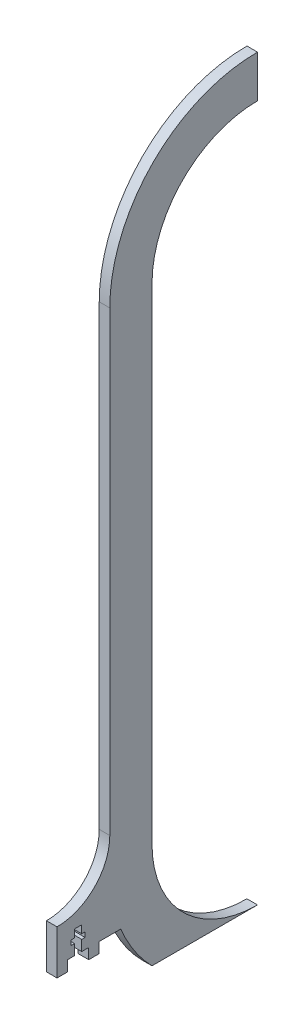
ISO-10303-21;
HEADER;
FILE_DESCRIPTION(('STEP AP214'),'2;1');
FILE_NAME('part.step','',(''),(''),'','','');
FILE_SCHEMA(('AUTOMOTIVE_DESIGN { 1 0 10303 214 1 1 1 1 }'));
ENDSEC;
DATA;
#1=APPLICATION_CONTEXT('core data for automotive mechanical design processes');
#2=APPLICATION_PROTOCOL_DEFINITION('international standard','automotive_design',2000,#1);
#3=PRODUCT_CONTEXT('',#1,'mechanical');
#4=PRODUCT('Part','Part','',(#3));
#5=PRODUCT_RELATED_PRODUCT_CATEGORY('part','',(#4));
#6=PRODUCT_DEFINITION_FORMATION('','',#4);
#7=PRODUCT_DEFINITION_CONTEXT('part definition',#1,'design');
#8=PRODUCT_DEFINITION('design','',#6,#7);
#9=PRODUCT_DEFINITION_SHAPE('','',#8);
#10=(LENGTH_UNIT() NAMED_UNIT(*) SI_UNIT(.MILLI.,.METRE.));
#11=(NAMED_UNIT(*) PLANE_ANGLE_UNIT() SI_UNIT($,.RADIAN.));
#12=(NAMED_UNIT(*) SI_UNIT($,.STERADIAN.) SOLID_ANGLE_UNIT());
#13=UNCERTAINTY_MEASURE_WITH_UNIT(LENGTH_MEASURE(1.E-05),#10,'distance_accuracy_value','');
#14=(GEOMETRIC_REPRESENTATION_CONTEXT(3) GLOBAL_UNCERTAINTY_ASSIGNED_CONTEXT((#13)) GLOBAL_UNIT_ASSIGNED_CONTEXT((#10,
#11,#12)) REPRESENTATION_CONTEXT('',''));
#15=CARTESIAN_POINT('',(0.,0.,0.));
#16=DIRECTION('',(0.,0.,1.));
#17=DIRECTION('',(1.,0.,0.));
#18=AXIS2_PLACEMENT_3D('',#15,#16,#17);
#19=CARTESIAN_POINT('',(6.35,-180.975,42.291));
#20=DIRECTION('',(0.,1.,0.));
#21=DIRECTION('',(0.,0.,1.));
#22=AXIS2_PLACEMENT_3D('',#19,#20,#21);
#23=PLANE('',#22);
#24=DIRECTION('',(0.,0.,-1.));
#25=VECTOR('',#24,1.);
#26=CARTESIAN_POINT('',(0.,-180.975,42.291));
#27=LINE('',#26,#25);
#28=CARTESIAN_POINT('',(0.,-180.975,42.291));
#29=VERTEX_POINT('',#28);
#30=CARTESIAN_POINT('',(0.,-180.975,38.1));
#31=VERTEX_POINT('',#30);
#32=EDGE_CURVE('E254',#29,#31,#27,.T.);
#33=ORIENTED_EDGE('',*,*,#32,.T.);
#34=DIRECTION('',(-1.,0.,0.));
#35=VECTOR('',#34,1.);
#36=CARTESIAN_POINT('',(6.35,-180.975,38.1));
#37=LINE('',#36,#35);
#38=CARTESIAN_POINT('',(6.35,-180.975,38.1));
#39=VERTEX_POINT('',#38);
#40=EDGE_CURVE('E11',#39,#31,#37,.T.);
#41=ORIENTED_EDGE('',*,*,#40,.F.);
#42=DIRECTION('',(0.,0.,-1.));
#43=VECTOR('',#42,1.);
#44=CARTESIAN_POINT('',(6.35,-180.975,42.291));
#45=LINE('',#44,#43);
#46=CARTESIAN_POINT('',(6.35,-180.975,42.291));
#47=VERTEX_POINT('',#46);
#48=EDGE_CURVE('E328',#47,#39,#45,.T.);
#49=ORIENTED_EDGE('',*,*,#48,.F.);
#50=DIRECTION('',(-1.,0.,0.));
#51=VECTOR('',#50,1.);
#52=CARTESIAN_POINT('',(6.35,-180.975,42.291));
#53=LINE('',#52,#51);
#54=EDGE_CURVE('E250',#47,#29,#53,.T.);
#55=ORIENTED_EDGE('',*,*,#54,.T.);
#56=EDGE_LOOP('',(#33,#41,#49,#55));
#57=FACE_BOUND('',#56,.T.);
#58=ADVANCED_FACE('F33',(#57),#23,.F.);
#59=CARTESIAN_POINT('',(6.35,-180.975,38.1));
#60=DIRECTION('',(0.,0.,-1.));
#61=DIRECTION('',(0.,1.,0.));
#62=AXIS2_PLACEMENT_3D('',#59,#60,#61);
#63=PLANE('',#62);
#64=DIRECTION('',(0.,-1.,0.));
#65=VECTOR('',#64,1.);
#66=CARTESIAN_POINT('',(0.,-180.975,38.1));
#67=LINE('',#66,#65);
#68=CARTESIAN_POINT('',(0.,-187.325,38.1));
#69=VERTEX_POINT('',#68);
#70=EDGE_CURVE('E257',#31,#69,#67,.T.);
#71=ORIENTED_EDGE('',*,*,#70,.T.);
#72=DIRECTION('',(-1.,0.,0.));
#73=VECTOR('',#72,1.);
#74=CARTESIAN_POINT('',(6.35,-187.325,38.1));
#75=LINE('',#74,#73);
#76=CARTESIAN_POINT('',(6.35,-187.325,38.1));
#77=VERTEX_POINT('',#76);
#78=EDGE_CURVE('E41',#77,#69,#75,.T.);
#79=ORIENTED_EDGE('',*,*,#78,.F.);
#80=DIRECTION('',(0.,-1.,0.));
#81=VECTOR('',#80,1.);
#82=CARTESIAN_POINT('',(6.35,-180.975,38.1));
#83=LINE('',#82,#81);
#84=EDGE_CURVE('E151',#39,#77,#83,.T.);
#85=ORIENTED_EDGE('',*,*,#84,.F.);
#86=ORIENTED_EDGE('',*,*,#40,.T.);
#87=EDGE_LOOP('',(#71,#79,#85,#86));
#88=FACE_BOUND('',#87,.T.);
#89=ADVANCED_FACE('F477',(#88),#63,.F.);
#90=CARTESIAN_POINT('',(6.35,-187.325,38.1));
#91=DIRECTION('',(0.,1.,0.));
#92=DIRECTION('',(0.,0.,1.));
#93=AXIS2_PLACEMENT_3D('',#90,#91,#92);
#94=PLANE('',#93);
#95=DIRECTION('',(0.,0.,-1.));
#96=VECTOR('',#95,1.);
#97=CARTESIAN_POINT('',(0.,-187.325,38.1));
#98=LINE('',#97,#96);
#99=CARTESIAN_POINT('',(0.,-187.325,31.75));
#100=VERTEX_POINT('',#99);
#101=EDGE_CURVE('E259',#69,#100,#98,.T.);
#102=ORIENTED_EDGE('',*,*,#101,.T.);
#103=DIRECTION('',(-1.,0.,0.));
#104=VECTOR('',#103,1.);
#105=CARTESIAN_POINT('',(6.35,-187.325,31.75));
#106=LINE('',#105,#104);
#107=CARTESIAN_POINT('',(6.35,-187.325,31.75));
#108=VERTEX_POINT('',#107);
#109=EDGE_CURVE('E383',#108,#100,#106,.T.);
#110=ORIENTED_EDGE('',*,*,#109,.F.);
#111=DIRECTION('',(0.,0.,-1.));
#112=VECTOR('',#111,1.);
#113=CARTESIAN_POINT('',(6.35,-187.325,38.1));
#114=LINE('',#113,#112);
#115=EDGE_CURVE('E390',#77,#108,#114,.T.);
#116=ORIENTED_EDGE('',*,*,#115,.F.);
#117=ORIENTED_EDGE('',*,*,#78,.T.);
#118=EDGE_LOOP('',(#102,#110,#116,#117));
#119=FACE_BOUND('',#118,.T.);
#120=ADVANCED_FACE('F388',(#119),#94,.F.);
#121=CARTESIAN_POINT('',(6.35,-180.975,31.75));
#122=DIRECTION('',(0.,0.,-1.));
#123=DIRECTION('',(0.,1.,0.));
#124=AXIS2_PLACEMENT_3D('',#121,#122,#123);
#125=PLANE('',#124);
#126=DIRECTION('',(0.,-1.,0.));
#127=VECTOR('',#126,1.);
#128=CARTESIAN_POINT('',(0.,-180.975,31.75));
#129=LINE('',#128,#127);
#130=CARTESIAN_POINT('',(0.,-180.975,31.75));
#131=VERTEX_POINT('',#130);
#132=EDGE_CURVE('E262',#131,#100,#129,.T.);
#133=ORIENTED_EDGE('',*,*,#132,.F.);
#134=DIRECTION('',(-1.,0.,0.));
#135=VECTOR('',#134,1.);
#136=CARTESIAN_POINT('',(6.35,-180.975,31.75));
#137=LINE('',#136,#135);
#138=CARTESIAN_POINT('',(6.35,-180.975,31.75));
#139=VERTEX_POINT('',#138);
#140=EDGE_CURVE('E381',#139,#131,#137,.T.);
#141=ORIENTED_EDGE('',*,*,#140,.F.);
#142=DIRECTION('',(0.,-1.,0.));
#143=VECTOR('',#142,1.);
#144=CARTESIAN_POINT('',(6.35,-180.975,31.75));
#145=LINE('',#144,#143);
#146=EDGE_CURVE('E402',#139,#108,#145,.T.);
#147=ORIENTED_EDGE('',*,*,#146,.T.);
#148=ORIENTED_EDGE('',*,*,#109,.T.);
#149=EDGE_LOOP('',(#133,#141,#147,#148));
#150=FACE_BOUND('',#149,.T.);
#151=ADVANCED_FACE('F398',(#150),#125,.T.);
#152=CARTESIAN_POINT('',(6.35,-180.975,31.75));
#153=DIRECTION('',(0.,1.,0.));
#154=DIRECTION('',(0.,0.,1.));
#155=AXIS2_PLACEMENT_3D('',#152,#153,#154);
#156=PLANE('',#155);
#157=DIRECTION('',(0.,0.,-1.));
#158=VECTOR('',#157,1.);
#159=CARTESIAN_POINT('',(0.,-180.975,31.75));
#160=LINE('',#159,#158);
#161=CARTESIAN_POINT('',(0.,-180.975,18.7886576662999));
#162=VERTEX_POINT('',#161);
#163=EDGE_CURVE('E265',#131,#162,#160,.T.);
#164=ORIENTED_EDGE('',*,*,#163,.T.);
#165=DIRECTION('',(-1.,0.,0.));
#166=VECTOR('',#165,1.);
#167=CARTESIAN_POINT('',(6.35,-180.975,18.7886576662999));
#168=LINE('',#167,#166);
#169=CARTESIAN_POINT('',(6.35,-180.975,18.7886576662999));
#170=VERTEX_POINT('',#169);
#171=EDGE_CURVE('E378',#170,#162,#168,.T.);
#172=ORIENTED_EDGE('',*,*,#171,.F.);
#173=DIRECTION('',(0.,0.,-1.));
#174=VECTOR('',#173,1.);
#175=CARTESIAN_POINT('',(6.35,-180.975,31.75));
#176=LINE('',#175,#174);
#177=EDGE_CURVE('E403',#139,#170,#176,.T.);
#178=ORIENTED_EDGE('',*,*,#177,.F.);
#179=ORIENTED_EDGE('',*,*,#140,.T.);
#180=EDGE_LOOP('',(#164,#172,#178,#179));
#181=FACE_BOUND('',#180,.T.);
#182=ADVANCED_FACE('F488',(#181),#156,.F.);
#183=CARTESIAN_POINT('',(6.35,-147.332960533307,-63.5));
#184=DIRECTION('',(-1.,0.,0.));
#185=DIRECTION('',(0.,0.,1.));
#186=AXIS2_PLACEMENT_3D('',#183,#184,#185);
#187=CYLINDRICAL_SURFACE('',#186,88.8999999999999);
#188=CARTESIAN_POINT('',(0.,-147.332960533307,-63.5));
#189=DIRECTION('',(1.,0.,0.));
#190=DIRECTION('',(0.,0.,-1.));
#191=AXIS2_PLACEMENT_3D('',#188,#189,#190);
#192=CIRCLE('',#191,88.8999999999999);
#193=CARTESIAN_POINT('',(0.,-209.55,0.));
#194=VERTEX_POINT('',#193);
#195=EDGE_CURVE('E267',#162,#194,#192,.T.);
#196=ORIENTED_EDGE('',*,*,#195,.T.);
#197=DIRECTION('',(-1.,0.,0.));
#198=VECTOR('',#197,1.);
#199=CARTESIAN_POINT('',(6.35,-209.55,0.));
#200=LINE('',#199,#198);
#201=CARTESIAN_POINT('',(6.35,-209.55,0.));
#202=VERTEX_POINT('',#201);
#203=EDGE_CURVE('E376',#202,#194,#200,.T.);
#204=ORIENTED_EDGE('',*,*,#203,.F.);
#205=CARTESIAN_POINT('',(6.35,-147.332960533307,-63.5));
#206=DIRECTION('',(1.,0.,0.));
#207=DIRECTION('',(0.,0.,-1.));
#208=AXIS2_PLACEMENT_3D('',#205,#206,#207);
#209=CIRCLE('',#208,88.8999999999999);
#210=EDGE_CURVE('E405',#170,#202,#209,.T.);
#211=ORIENTED_EDGE('',*,*,#210,.F.);
#212=ORIENTED_EDGE('',*,*,#171,.T.);
#213=EDGE_LOOP('',(#196,#204,#211,#212));
#214=FACE_BOUND('',#213,.T.);
#215=ADVANCED_FACE('F491',(#214),#187,.T.);
#216=CARTESIAN_POINT('',(6.35,-209.55,-63.5));
#217=DIRECTION('',(0.,-1.,0.));
#218=DIRECTION('',(0.,0.,-1.));
#219=AXIS2_PLACEMENT_3D('',#216,#217,#218);
#220=PLANE('',#219);
#221=DIRECTION('',(0.,0.,1.));
#222=VECTOR('',#221,1.);
#223=CARTESIAN_POINT('',(0.,-209.55,-63.5));
#224=LINE('',#223,#222);
#225=CARTESIAN_POINT('',(0.,-209.55,-63.5));
#226=VERTEX_POINT('',#225);
#227=EDGE_CURVE('E270',#226,#194,#224,.T.);
#228=ORIENTED_EDGE('',*,*,#227,.F.);
#229=DIRECTION('',(-1.,0.,0.));
#230=VECTOR('',#229,1.);
#231=CARTESIAN_POINT('',(6.35,-209.55,-63.5));
#232=LINE('',#231,#230);
#233=CARTESIAN_POINT('',(6.35,-209.55,-63.5));
#234=VERTEX_POINT('',#233);
#235=EDGE_CURVE('E374',#234,#226,#232,.T.);
#236=ORIENTED_EDGE('',*,*,#235,.F.);
#237=DIRECTION('',(0.,0.,1.));
#238=VECTOR('',#237,1.);
#239=CARTESIAN_POINT('',(6.35,-209.55,-63.5));
#240=LINE('',#239,#238);
#241=EDGE_CURVE('E411',#234,#202,#240,.T.);
#242=ORIENTED_EDGE('',*,*,#241,.T.);
#243=ORIENTED_EDGE('',*,*,#203,.T.);
#244=EDGE_LOOP('',(#228,#236,#242,#243));
#245=FACE_BOUND('',#244,.T.);
#246=ADVANCED_FACE('F495',(#245),#220,.T.);
#247=CARTESIAN_POINT('',(6.35,-146.05,-63.5));
#248=DIRECTION('',(-1.,0.,0.));
#249=DIRECTION('',(0.,0.,1.));
#250=AXIS2_PLACEMENT_3D('',#247,#248,#249);
#251=CYLINDRICAL_SURFACE('',#250,63.5);
#252=CARTESIAN_POINT('',(0.,-146.05,-63.5));
#253=DIRECTION('',(1.,0.,0.));
#254=DIRECTION('',(0.,0.,-1.));
#255=AXIS2_PLACEMENT_3D('',#252,#253,#254);
#256=CIRCLE('',#255,63.5);
#257=CARTESIAN_POINT('',(0.,-146.05,0.));
#258=VERTEX_POINT('',#257);
#259=EDGE_CURVE('E273',#258,#226,#256,.T.);
#260=ORIENTED_EDGE('',*,*,#259,.F.);
#261=DIRECTION('',(-1.,0.,0.));
#262=VECTOR('',#261,1.);
#263=CARTESIAN_POINT('',(6.35,-146.05,0.));
#264=LINE('',#263,#262);
#265=CARTESIAN_POINT('',(6.35,-146.05,0.));
#266=VERTEX_POINT('',#265);
#267=EDGE_CURVE('E372',#266,#258,#264,.T.);
#268=ORIENTED_EDGE('',*,*,#267,.F.);
#269=CARTESIAN_POINT('',(6.35,-146.05,-63.5));
#270=DIRECTION('',(1.,0.,0.));
#271=DIRECTION('',(0.,0.,-1.));
#272=AXIS2_PLACEMENT_3D('',#269,#270,#271);
#273=CIRCLE('',#272,63.5);
#274=EDGE_CURVE('E414',#266,#234,#273,.T.);
#275=ORIENTED_EDGE('',*,*,#274,.T.);
#276=ORIENTED_EDGE('',*,*,#235,.T.);
#277=EDGE_LOOP('',(#260,#268,#275,#276));
#278=FACE_BOUND('',#277,.T.);
#279=ADVANCED_FACE('F499',(#278),#251,.F.);
#280=CARTESIAN_POINT('',(6.35,146.05,0.));
#281=DIRECTION('',(0.,0.,-1.));
#282=DIRECTION('',(-1.,0.,0.));
#283=AXIS2_PLACEMENT_3D('',#280,#281,#282);
#284=PLANE('',#283);
#285=DIRECTION('',(0.,-1.,0.));
#286=VECTOR('',#285,1.);
#287=CARTESIAN_POINT('',(0.,146.05,0.));
#288=LINE('',#287,#286);
#289=CARTESIAN_POINT('',(0.,146.05,0.));
#290=VERTEX_POINT('',#289);
#291=EDGE_CURVE('E276',#290,#258,#288,.T.);
#292=ORIENTED_EDGE('',*,*,#291,.F.);
#293=DIRECTION('',(-1.,0.,0.));
#294=VECTOR('',#293,1.);
#295=CARTESIAN_POINT('',(6.35,146.05,0.));
#296=LINE('',#295,#294);
#297=CARTESIAN_POINT('',(6.35,146.05,0.));
#298=VERTEX_POINT('',#297);
#299=EDGE_CURVE('E370',#298,#290,#296,.T.);
#300=ORIENTED_EDGE('',*,*,#299,.F.);
#301=DIRECTION('',(0.,-1.,0.));
#302=VECTOR('',#301,1.);
#303=CARTESIAN_POINT('',(6.35,146.05,0.));
#304=LINE('',#303,#302);
#305=EDGE_CURVE('E417',#298,#266,#304,.T.);
#306=ORIENTED_EDGE('',*,*,#305,.T.);
#307=ORIENTED_EDGE('',*,*,#267,.T.);
#308=EDGE_LOOP('',(#292,#300,#306,#307));
#309=FACE_BOUND('',#308,.T.);
#310=ADVANCED_FACE('F503',(#309),#284,.T.);
#311=CARTESIAN_POINT('',(6.35,146.05,-63.5));
#312=DIRECTION('',(-1.,0.,0.));
#313=DIRECTION('',(0.,0.,1.));
#314=AXIS2_PLACEMENT_3D('',#311,#312,#313);
#315=CYLINDRICAL_SURFACE('',#314,63.5);
#316=CARTESIAN_POINT('',(0.,146.05,-63.5));
#317=DIRECTION('',(-1.,0.,0.));
#318=DIRECTION('',(0.,0.,1.));
#319=AXIS2_PLACEMENT_3D('',#316,#317,#318);
#320=CIRCLE('',#319,63.5);
#321=CARTESIAN_POINT('',(0.,209.55,-63.5));
#322=VERTEX_POINT('',#321);
#323=EDGE_CURVE('E279',#290,#322,#320,.T.);
#324=ORIENTED_EDGE('',*,*,#323,.T.);
#325=DIRECTION('',(-1.,0.,0.));
#326=VECTOR('',#325,1.);
#327=CARTESIAN_POINT('',(6.35,209.55,-63.5));
#328=LINE('',#327,#326);
#329=CARTESIAN_POINT('',(6.35,209.55,-63.5));
#330=VERTEX_POINT('',#329);
#331=EDGE_CURVE('E367',#330,#322,#328,.T.);
#332=ORIENTED_EDGE('',*,*,#331,.F.);
#333=CARTESIAN_POINT('',(6.35,146.05,-63.5));
#334=DIRECTION('',(-1.,0.,0.));
#335=DIRECTION('',(0.,0.,1.));
#336=AXIS2_PLACEMENT_3D('',#333,#334,#335);
#337=CIRCLE('',#336,63.5);
#338=EDGE_CURVE('E420',#298,#330,#337,.T.);
#339=ORIENTED_EDGE('',*,*,#338,.F.);
#340=ORIENTED_EDGE('',*,*,#299,.T.);
#341=EDGE_LOOP('',(#324,#332,#339,#340));
#342=FACE_BOUND('',#341,.T.);
#343=ADVANCED_FACE('F507',(#342),#315,.F.);
#344=CARTESIAN_POINT('',(6.35,209.55,-63.5));
#345=DIRECTION('',(0.,0.,1.));
#346=DIRECTION('',(1.,0.,0.));
#347=AXIS2_PLACEMENT_3D('',#344,#345,#346);
#348=PLANE('',#347);
#349=DIRECTION('',(0.,1.,0.));
#350=VECTOR('',#349,1.);
#351=CARTESIAN_POINT('',(0.,209.55,-63.5));
#352=LINE('',#351,#350);
#353=CARTESIAN_POINT('',(0.,234.95,-63.5));
#354=VERTEX_POINT('',#353);
#355=EDGE_CURVE('E281',#322,#354,#352,.T.);
#356=ORIENTED_EDGE('',*,*,#355,.T.);
#357=DIRECTION('',(-1.,0.,0.));
#358=VECTOR('',#357,1.);
#359=CARTESIAN_POINT('',(6.35,234.95,-63.5));
#360=LINE('',#359,#358);
#361=CARTESIAN_POINT('',(6.35,234.95,-63.5));
#362=VERTEX_POINT('',#361);
#363=EDGE_CURVE('E364',#362,#354,#360,.T.);
#364=ORIENTED_EDGE('',*,*,#363,.F.);
#365=DIRECTION('',(0.,1.,0.));
#366=VECTOR('',#365,1.);
#367=CARTESIAN_POINT('',(6.35,209.55,-63.5));
#368=LINE('',#367,#366);
#369=EDGE_CURVE('E422',#330,#362,#368,.T.);
#370=ORIENTED_EDGE('',*,*,#369,.F.);
#371=ORIENTED_EDGE('',*,*,#331,.T.);
#372=EDGE_LOOP('',(#356,#364,#370,#371));
#373=FACE_BOUND('',#372,.T.);
#374=ADVANCED_FACE('F511',(#373),#348,.F.);
#375=CARTESIAN_POINT('',(6.35,146.05,-63.5));
#376=DIRECTION('',(-1.,0.,0.));
#377=DIRECTION('',(0.,0.,1.));
#378=AXIS2_PLACEMENT_3D('',#375,#376,#377);
#379=CYLINDRICAL_SURFACE('',#378,88.9);
#380=CARTESIAN_POINT('',(0.,146.05,-63.5));
#381=DIRECTION('',(1.,0.,0.));
#382=DIRECTION('',(0.,0.,-1.));
#383=AXIS2_PLACEMENT_3D('',#380,#381,#382);
#384=CIRCLE('',#383,88.9);
#385=CARTESIAN_POINT('',(0.,146.05,25.4));
#386=VERTEX_POINT('',#385);
#387=EDGE_CURVE('E283',#354,#386,#384,.T.);
#388=ORIENTED_EDGE('',*,*,#387,.T.);
#389=DIRECTION('',(-1.,0.,0.));
#390=VECTOR('',#389,1.);
#391=CARTESIAN_POINT('',(6.35,146.05,25.4));
#392=LINE('',#391,#390);
#393=CARTESIAN_POINT('',(6.35,146.05,25.4));
#394=VERTEX_POINT('',#393);
#395=EDGE_CURVE('E361',#394,#386,#392,.T.);
#396=ORIENTED_EDGE('',*,*,#395,.F.);
#397=CARTESIAN_POINT('',(6.35,146.05,-63.5));
#398=DIRECTION('',(1.,0.,0.));
#399=DIRECTION('',(0.,0.,-1.));
#400=AXIS2_PLACEMENT_3D('',#397,#398,#399);
#401=CIRCLE('',#400,88.9);
#402=EDGE_CURVE('E424',#362,#394,#401,.T.);
#403=ORIENTED_EDGE('',*,*,#402,.F.);
#404=ORIENTED_EDGE('',*,*,#363,.T.);
#405=EDGE_LOOP('',(#388,#396,#403,#404));
#406=FACE_BOUND('',#405,.T.);
#407=ADVANCED_FACE('F515',(#406),#379,.T.);
#408=CARTESIAN_POINT('',(6.35,146.05,25.4));
#409=DIRECTION('',(0.,0.,-1.));
#410=DIRECTION('',(0.,1.,0.));
#411=AXIS2_PLACEMENT_3D('',#408,#409,#410);
#412=PLANE('',#411);
#413=DIRECTION('',(0.,-1.,0.));
#414=VECTOR('',#413,1.);
#415=CARTESIAN_POINT('',(0.,146.05,25.4));
#416=LINE('',#415,#414);
#417=CARTESIAN_POINT('',(0.,-128.904999999999,25.4));
#418=VERTEX_POINT('',#417);
#419=EDGE_CURVE('E285',#386,#418,#416,.T.);
#420=ORIENTED_EDGE('',*,*,#419,.T.);
#421=DIRECTION('',(-1.,0.,0.));
#422=VECTOR('',#421,1.);
#423=CARTESIAN_POINT('',(6.35,-128.904999999999,25.4));
#424=LINE('',#423,#422);
#425=CARTESIAN_POINT('',(6.35,-128.904999999999,25.4));
#426=VERTEX_POINT('',#425);
#427=EDGE_CURVE('E359',#426,#418,#424,.T.);
#428=ORIENTED_EDGE('',*,*,#427,.F.);
#429=DIRECTION('',(0.,-1.,0.));
#430=VECTOR('',#429,1.);
#431=CARTESIAN_POINT('',(6.35,146.05,25.4));
#432=LINE('',#431,#430);
#433=EDGE_CURVE('E426',#394,#426,#432,.T.);
#434=ORIENTED_EDGE('',*,*,#433,.F.);
#435=ORIENTED_EDGE('',*,*,#395,.T.);
#436=EDGE_LOOP('',(#420,#428,#434,#435));
#437=FACE_BOUND('',#436,.T.);
#438=ADVANCED_FACE('F519',(#437),#412,.F.);
#439=CARTESIAN_POINT('',(6.35,-128.904999999999,57.15));
#440=DIRECTION('',(-1.,0.,0.));
#441=DIRECTION('',(0.,0.,1.));
#442=AXIS2_PLACEMENT_3D('',#439,#440,#441);
#443=CYLINDRICAL_SURFACE('',#442,31.75);
#444=CARTESIAN_POINT('',(0.,-128.904999999999,57.15));
#445=DIRECTION('',(1.,0.,0.));
#446=DIRECTION('',(0.,0.,-1.));
#447=AXIS2_PLACEMENT_3D('',#444,#445,#446);
#448=CIRCLE('',#447,31.75);
#449=CARTESIAN_POINT('',(0.,-160.654999999999,57.15));
#450=VERTEX_POINT('',#449);
#451=EDGE_CURVE('E288',#450,#418,#448,.T.);
#452=ORIENTED_EDGE('',*,*,#451,.F.);
#453=DIRECTION('',(-1.,0.,0.));
#454=VECTOR('',#453,1.);
#455=CARTESIAN_POINT('',(6.35,-160.654999999999,57.15));
#456=LINE('',#455,#454);
#457=CARTESIAN_POINT('',(6.35,-160.654999999999,57.15));
#458=VERTEX_POINT('',#457);
#459=EDGE_CURVE('E357',#458,#450,#456,.T.);
#460=ORIENTED_EDGE('',*,*,#459,.F.);
#461=CARTESIAN_POINT('',(6.35,-128.904999999999,57.15));
#462=DIRECTION('',(1.,0.,0.));
#463=DIRECTION('',(0.,0.,-1.));
#464=AXIS2_PLACEMENT_3D('',#461,#462,#463);
#465=CIRCLE('',#464,31.75);
#466=EDGE_CURVE('E428',#458,#426,#465,.T.);
#467=ORIENTED_EDGE('',*,*,#466,.T.);
#468=ORIENTED_EDGE('',*,*,#427,.T.);
#469=EDGE_LOOP('',(#452,#460,#467,#468));
#470=FACE_BOUND('',#469,.T.);
#471=ADVANCED_FACE('F523',(#470),#443,.F.);
#472=CARTESIAN_POINT('',(6.35,-160.654999999999,57.15));
#473=DIRECTION('',(0.,0.,-1.));
#474=DIRECTION('',(0.,1.,0.));
#475=AXIS2_PLACEMENT_3D('',#472,#473,#474);
#476=PLANE('',#475);
#477=DIRECTION('',(0.,-1.,0.));
#478=VECTOR('',#477,1.);
#479=CARTESIAN_POINT('',(0.,-160.654999999999,57.15));
#480=LINE('',#479,#478);
#481=CARTESIAN_POINT('',(0.,-187.325,57.15));
#482=VERTEX_POINT('',#481);
#483=EDGE_CURVE('E291',#450,#482,#480,.T.);
#484=ORIENTED_EDGE('',*,*,#483,.T.);
#485=DIRECTION('',(-1.,0.,0.));
#486=VECTOR('',#485,1.);
#487=CARTESIAN_POINT('',(6.35,-187.325,57.15));
#488=LINE('',#487,#486);
#489=CARTESIAN_POINT('',(6.35,-187.325,57.15));
#490=VERTEX_POINT('',#489);
#491=EDGE_CURVE('E354',#490,#482,#488,.T.);
#492=ORIENTED_EDGE('',*,*,#491,.F.);
#493=DIRECTION('',(0.,-1.,0.));
#494=VECTOR('',#493,1.);
#495=CARTESIAN_POINT('',(6.35,-160.654999999999,57.15));
#496=LINE('',#495,#494);
#497=EDGE_CURVE('E431',#458,#490,#496,.T.);
#498=ORIENTED_EDGE('',*,*,#497,.F.);
#499=ORIENTED_EDGE('',*,*,#459,.T.);
#500=EDGE_LOOP('',(#484,#492,#498,#499));
#501=FACE_BOUND('',#500,.T.);
#502=ADVANCED_FACE('F527',(#501),#476,.F.);
#503=CARTESIAN_POINT('',(6.35,-187.325,57.15));
#504=DIRECTION('',(0.,1.,0.));
#505=DIRECTION('',(0.,0.,1.));
#506=AXIS2_PLACEMENT_3D('',#503,#504,#505);
#507=PLANE('',#506);
#508=DIRECTION('',(0.,0.,-1.));
#509=VECTOR('',#508,1.);
#510=CARTESIAN_POINT('',(0.,-187.325,57.15));
#511=LINE('',#510,#509);
#512=CARTESIAN_POINT('',(0.,-187.325,50.8));
#513=VERTEX_POINT('',#512);
#514=EDGE_CURVE('E293',#482,#513,#511,.T.);
#515=ORIENTED_EDGE('',*,*,#514,.T.);
#516=DIRECTION('',(-1.,0.,0.));
#517=VECTOR('',#516,1.);
#518=CARTESIAN_POINT('',(6.35,-187.325,50.8));
#519=LINE('',#518,#517);
#520=CARTESIAN_POINT('',(6.35,-187.325,50.8));
#521=VERTEX_POINT('',#520);
#522=EDGE_CURVE('E351',#521,#513,#519,.T.);
#523=ORIENTED_EDGE('',*,*,#522,.F.);
#524=DIRECTION('',(0.,0.,-1.));
#525=VECTOR('',#524,1.);
#526=CARTESIAN_POINT('',(6.35,-187.325,57.15));
#527=LINE('',#526,#525);
#528=EDGE_CURVE('E433',#490,#521,#527,.T.);
#529=ORIENTED_EDGE('',*,*,#528,.F.);
#530=ORIENTED_EDGE('',*,*,#491,.T.);
#531=EDGE_LOOP('',(#515,#523,#529,#530));
#532=FACE_BOUND('',#531,.T.);
#533=ADVANCED_FACE('F531',(#532),#507,.F.);
#534=CARTESIAN_POINT('',(6.35,-187.325,50.8));
#535=DIRECTION('',(0.,0.,1.));
#536=DIRECTION('',(0.,-1.,0.));
#537=AXIS2_PLACEMENT_3D('',#534,#535,#536);
#538=PLANE('',#537);
#539=DIRECTION('',(0.,1.,0.));
#540=VECTOR('',#539,1.);
#541=CARTESIAN_POINT('',(0.,-187.325,50.8));
#542=LINE('',#541,#540);
#543=CARTESIAN_POINT('',(0.,-180.975,50.8));
#544=VERTEX_POINT('',#543);
#545=EDGE_CURVE('E295',#513,#544,#542,.T.);
#546=ORIENTED_EDGE('',*,*,#545,.T.);
#547=DIRECTION('',(-1.,0.,0.));
#548=VECTOR('',#547,1.);
#549=CARTESIAN_POINT('',(6.35,-180.975,50.8));
#550=LINE('',#549,#548);
#551=CARTESIAN_POINT('',(6.35,-180.975,50.8));
#552=VERTEX_POINT('',#551);
#553=EDGE_CURVE('E348',#552,#544,#550,.T.);
#554=ORIENTED_EDGE('',*,*,#553,.F.);
#555=DIRECTION('',(0.,1.,0.));
#556=VECTOR('',#555,1.);
#557=CARTESIAN_POINT('',(6.35,-187.325,50.8));
#558=LINE('',#557,#556);
#559=EDGE_CURVE('E435',#521,#552,#558,.T.);
#560=ORIENTED_EDGE('',*,*,#559,.F.);
#561=ORIENTED_EDGE('',*,*,#522,.T.);
#562=EDGE_LOOP('',(#546,#554,#560,#561));
#563=FACE_BOUND('',#562,.T.);
#564=ADVANCED_FACE('F535',(#563),#538,.F.);
#565=CARTESIAN_POINT('',(6.35,-180.975,50.8));
#566=DIRECTION('',(0.,1.,0.));
#567=DIRECTION('',(0.,0.,1.));
#568=AXIS2_PLACEMENT_3D('',#565,#566,#567);
#569=PLANE('',#568);
#570=DIRECTION('',(0.,0.,-1.));
#571=VECTOR('',#570,1.);
#572=CARTESIAN_POINT('',(0.,-180.975,50.8));
#573=LINE('',#572,#571);
#574=CARTESIAN_POINT('',(0.,-180.975,46.609));
#575=VERTEX_POINT('',#574);
#576=EDGE_CURVE('E297',#544,#575,#573,.T.);
#577=ORIENTED_EDGE('',*,*,#576,.T.);
#578=DIRECTION('',(-1.,0.,0.));
#579=VECTOR('',#578,1.);
#580=CARTESIAN_POINT('',(6.35,-180.975,46.609));
#581=LINE('',#580,#579);
#582=CARTESIAN_POINT('',(6.35,-180.975,46.609));
#583=VERTEX_POINT('',#582);
#584=EDGE_CURVE('E346',#583,#575,#581,.T.);
#585=ORIENTED_EDGE('',*,*,#584,.F.);
#586=DIRECTION('',(0.,0.,-1.));
#587=VECTOR('',#586,1.);
#588=CARTESIAN_POINT('',(6.35,-180.975,50.8));
#589=LINE('',#588,#587);
#590=EDGE_CURVE('E437',#552,#583,#589,.T.);
#591=ORIENTED_EDGE('',*,*,#590,.F.);
#592=ORIENTED_EDGE('',*,*,#553,.T.);
#593=EDGE_LOOP('',(#577,#585,#591,#592));
#594=FACE_BOUND('',#593,.T.);
#595=ADVANCED_FACE('F539',(#594),#569,.F.);
#596=CARTESIAN_POINT('',(6.35,-174.625,46.609));
#597=DIRECTION('',(0.,0.,-1.));
#598=DIRECTION('',(-1.,0.,0.));
#599=AXIS2_PLACEMENT_3D('',#596,#597,#598);
#600=PLANE('',#599);
#601=DIRECTION('',(0.,-1.,0.));
#602=VECTOR('',#601,1.);
#603=CARTESIAN_POINT('',(0.,-174.625,46.609));
#604=LINE('',#603,#602);
#605=CARTESIAN_POINT('',(0.,-174.625,46.609));
#606=VERTEX_POINT('',#605);
#607=EDGE_CURVE('E300',#606,#575,#604,.T.);
#608=ORIENTED_EDGE('',*,*,#607,.F.);
#609=DIRECTION('',(-1.,0.,0.));
#610=VECTOR('',#609,1.);
#611=CARTESIAN_POINT('',(6.35,-174.625,46.609));
#612=LINE('',#611,#610);
#613=CARTESIAN_POINT('',(6.35,-174.625,46.609));
#614=VERTEX_POINT('',#613);
#615=EDGE_CURVE('E344',#614,#606,#612,.T.);
#616=ORIENTED_EDGE('',*,*,#615,.F.);
#617=DIRECTION('',(0.,-1.,0.));
#618=VECTOR('',#617,1.);
#619=CARTESIAN_POINT('',(6.35,-174.625,46.609));
#620=LINE('',#619,#618);
#621=EDGE_CURVE('E439',#614,#583,#620,.T.);
#622=ORIENTED_EDGE('',*,*,#621,.T.);
#623=ORIENTED_EDGE('',*,*,#584,.T.);
#624=EDGE_LOOP('',(#608,#616,#622,#623));
#625=FACE_BOUND('',#624,.T.);
#626=ADVANCED_FACE('F543',(#625),#600,.T.);
#627=CARTESIAN_POINT('',(6.35,-174.625,48.649999982));
#628=DIRECTION('',(0.,1.,0.));
#629=DIRECTION('',(0.,0.,1.));
#630=AXIS2_PLACEMENT_3D('',#627,#628,#629);
#631=PLANE('',#630);
#632=DIRECTION('',(0.,0.,-1.));
#633=VECTOR('',#632,1.);
#634=CARTESIAN_POINT('',(0.,-174.625,48.649999982));
#635=LINE('',#634,#633);
#636=CARTESIAN_POINT('',(0.,-174.625,48.649999982));
#637=VERTEX_POINT('',#636);
#638=EDGE_CURVE('E303',#637,#606,#635,.T.);
#639=ORIENTED_EDGE('',*,*,#638,.F.);
#640=DIRECTION('',(-1.,0.,0.));
#641=VECTOR('',#640,1.);
#642=CARTESIAN_POINT('',(6.35,-174.625,48.649999982));
#643=LINE('',#642,#641);
#644=CARTESIAN_POINT('',(6.35,-174.625,48.649999982));
#645=VERTEX_POINT('',#644);
#646=EDGE_CURVE('E342',#645,#637,#643,.T.);
#647=ORIENTED_EDGE('',*,*,#646,.F.);
#648=DIRECTION('',(0.,0.,-1.));
#649=VECTOR('',#648,1.);
#650=CARTESIAN_POINT('',(6.35,-174.625,48.649999982));
#651=LINE('',#650,#649);
#652=EDGE_CURVE('E442',#645,#614,#651,.T.);
#653=ORIENTED_EDGE('',*,*,#652,.T.);
#654=ORIENTED_EDGE('',*,*,#615,.T.);
#655=EDGE_LOOP('',(#639,#647,#653,#654));
#656=FACE_BOUND('',#655,.T.);
#657=ADVANCED_FACE('F547',(#656),#631,.T.);
#658=CARTESIAN_POINT('',(6.35,-171.724999958003,48.649999982));
#659=DIRECTION('',(0.,0.,-1.));
#660=DIRECTION('',(-1.,0.,0.));
#661=AXIS2_PLACEMENT_3D('',#658,#659,#660);
#662=PLANE('',#661);
#663=DIRECTION('',(0.,-1.,0.));
#664=VECTOR('',#663,1.);
#665=CARTESIAN_POINT('',(0.,-171.724999958003,48.649999982));
#666=LINE('',#665,#664);
#667=CARTESIAN_POINT('',(0.,-171.724999958003,48.649999982));
#668=VERTEX_POINT('',#667);
#669=EDGE_CURVE('E306',#668,#637,#666,.T.);
#670=ORIENTED_EDGE('',*,*,#669,.F.);
#671=DIRECTION('',(-1.,0.,0.));
#672=VECTOR('',#671,1.);
#673=CARTESIAN_POINT('',(6.35,-171.724999958003,48.649999982));
#674=LINE('',#673,#672);
#675=CARTESIAN_POINT('',(6.35,-171.724999958003,48.649999982));
#676=VERTEX_POINT('',#675);
#677=EDGE_CURVE('E340',#676,#668,#674,.T.);
#678=ORIENTED_EDGE('',*,*,#677,.F.);
#679=DIRECTION('',(0.,-1.,0.));
#680=VECTOR('',#679,1.);
#681=CARTESIAN_POINT('',(6.35,-171.724999958003,48.649999982));
#682=LINE('',#681,#680);
#683=EDGE_CURVE('E445',#676,#645,#682,.T.);
#684=ORIENTED_EDGE('',*,*,#683,.T.);
#685=ORIENTED_EDGE('',*,*,#646,.T.);
#686=EDGE_LOOP('',(#670,#678,#684,#685));
#687=FACE_BOUND('',#686,.T.);
#688=ADVANCED_FACE('F551',(#687),#662,.T.);
#689=CARTESIAN_POINT('',(6.35,-171.724999958003,46.609));
#690=DIRECTION('',(0.,-1.,0.));
#691=DIRECTION('',(0.,0.,-1.));
#692=AXIS2_PLACEMENT_3D('',#689,#690,#691);
#693=PLANE('',#692);
#694=DIRECTION('',(0.,0.,1.));
#695=VECTOR('',#694,1.);
#696=CARTESIAN_POINT('',(0.,-171.724999958003,46.609));
#697=LINE('',#696,#695);
#698=CARTESIAN_POINT('',(0.,-171.724999958003,46.609));
#699=VERTEX_POINT('',#698);
#700=EDGE_CURVE('E309',#699,#668,#697,.T.);
#701=ORIENTED_EDGE('',*,*,#700,.F.);
#702=DIRECTION('',(-1.,0.,0.));
#703=VECTOR('',#702,1.);
#704=CARTESIAN_POINT('',(6.35,-171.724999958003,46.609));
#705=LINE('',#704,#703);
#706=CARTESIAN_POINT('',(6.35,-171.724999958003,46.609));
#707=VERTEX_POINT('',#706);
#708=EDGE_CURVE('E338',#707,#699,#705,.T.);
#709=ORIENTED_EDGE('',*,*,#708,.F.);
#710=DIRECTION('',(0.,0.,1.));
#711=VECTOR('',#710,1.);
#712=CARTESIAN_POINT('',(6.35,-171.724999958003,46.609));
#713=LINE('',#712,#711);
#714=EDGE_CURVE('E448',#707,#676,#713,.T.);
#715=ORIENTED_EDGE('',*,*,#714,.T.);
#716=ORIENTED_EDGE('',*,*,#677,.T.);
#717=EDGE_LOOP('',(#701,#709,#715,#716));
#718=FACE_BOUND('',#717,.T.);
#719=ADVANCED_FACE('F555',(#718),#693,.T.);
#720=CARTESIAN_POINT('',(6.35,-167.005,46.609));
#721=DIRECTION('',(0.,0.,-1.));
#722=DIRECTION('',(-1.,0.,0.));
#723=AXIS2_PLACEMENT_3D('',#720,#721,#722);
#724=PLANE('',#723);
#725=DIRECTION('',(0.,-1.,0.));
#726=VECTOR('',#725,1.);
#727=CARTESIAN_POINT('',(0.,-167.005,46.609));
#728=LINE('',#727,#726);
#729=CARTESIAN_POINT('',(0.,-167.005,46.609));
#730=VERTEX_POINT('',#729);
#731=EDGE_CURVE('E312',#730,#699,#728,.T.);
#732=ORIENTED_EDGE('',*,*,#731,.F.);
#733=DIRECTION('',(-1.,0.,0.));
#734=VECTOR('',#733,1.);
#735=CARTESIAN_POINT('',(6.35,-167.005,46.609));
#736=LINE('',#735,#734);
#737=CARTESIAN_POINT('',(6.35,-167.005,46.609));
#738=VERTEX_POINT('',#737);
#739=EDGE_CURVE('E336',#738,#730,#736,.T.);
#740=ORIENTED_EDGE('',*,*,#739,.F.);
#741=DIRECTION('',(0.,-1.,0.));
#742=VECTOR('',#741,1.);
#743=CARTESIAN_POINT('',(6.35,-167.005,46.609));
#744=LINE('',#743,#742);
#745=EDGE_CURVE('E451',#738,#707,#744,.T.);
#746=ORIENTED_EDGE('',*,*,#745,.T.);
#747=ORIENTED_EDGE('',*,*,#708,.T.);
#748=EDGE_LOOP('',(#732,#740,#746,#747));
#749=FACE_BOUND('',#748,.T.);
#750=ADVANCED_FACE('F559',(#749),#724,.T.);
#751=CARTESIAN_POINT('',(6.35,-167.005,42.291));
#752=DIRECTION('',(0.,-1.,0.));
#753=DIRECTION('',(0.,0.,-1.));
#754=AXIS2_PLACEMENT_3D('',#751,#752,#753);
#755=PLANE('',#754);
#756=DIRECTION('',(0.,0.,1.));
#757=VECTOR('',#756,1.);
#758=CARTESIAN_POINT('',(0.,-167.005,42.291));
#759=LINE('',#758,#757);
#760=CARTESIAN_POINT('',(0.,-167.005,42.291));
#761=VERTEX_POINT('',#760);
#762=EDGE_CURVE('E315',#761,#730,#759,.T.);
#763=ORIENTED_EDGE('',*,*,#762,.F.);
#764=DIRECTION('',(-1.,0.,0.));
#765=VECTOR('',#764,1.);
#766=CARTESIAN_POINT('',(6.35,-167.005,42.291));
#767=LINE('',#766,#765);
#768=CARTESIAN_POINT('',(6.35,-167.005,42.291));
#769=VERTEX_POINT('',#768);
#770=EDGE_CURVE('E334',#769,#761,#767,.T.);
#771=ORIENTED_EDGE('',*,*,#770,.F.);
#772=DIRECTION('',(0.,0.,1.));
#773=VECTOR('',#772,1.);
#774=CARTESIAN_POINT('',(6.35,-167.005,42.291));
#775=LINE('',#774,#773);
#776=EDGE_CURVE('E454',#769,#738,#775,.T.);
#777=ORIENTED_EDGE('',*,*,#776,.T.);
#778=ORIENTED_EDGE('',*,*,#739,.T.);
#779=EDGE_LOOP('',(#763,#771,#777,#778));
#780=FACE_BOUND('',#779,.T.);
#781=ADVANCED_FACE('F563',(#780),#755,.T.);
#782=CARTESIAN_POINT('',(6.35,-171.724999958003,42.291));
#783=DIRECTION('',(0.,0.,1.));
#784=DIRECTION('',(1.,0.,0.));
#785=AXIS2_PLACEMENT_3D('',#782,#783,#784);
#786=PLANE('',#785);
#787=DIRECTION('',(0.,1.,0.));
#788=VECTOR('',#787,1.);
#789=CARTESIAN_POINT('',(0.,-171.724999958003,42.291));
#790=LINE('',#789,#788);
#791=CARTESIAN_POINT('',(0.,-171.724999958003,42.291));
#792=VERTEX_POINT('',#791);
#793=EDGE_CURVE('E318',#792,#761,#790,.T.);
#794=ORIENTED_EDGE('',*,*,#793,.F.);
#795=DIRECTION('',(-1.,0.,0.));
#796=VECTOR('',#795,1.);
#797=CARTESIAN_POINT('',(6.35,-171.724999958003,42.291));
#798=LINE('',#797,#796);
#799=CARTESIAN_POINT('',(6.35,-171.724999958003,42.291));
#800=VERTEX_POINT('',#799);
#801=EDGE_CURVE('E332',#800,#792,#798,.T.);
#802=ORIENTED_EDGE('',*,*,#801,.F.);
#803=DIRECTION('',(0.,1.,0.));
#804=VECTOR('',#803,1.);
#805=CARTESIAN_POINT('',(6.35,-171.724999958003,42.291));
#806=LINE('',#805,#804);
#807=EDGE_CURVE('E457',#800,#769,#806,.T.);
#808=ORIENTED_EDGE('',*,*,#807,.T.);
#809=ORIENTED_EDGE('',*,*,#770,.T.);
#810=EDGE_LOOP('',(#794,#802,#808,#809));
#811=FACE_BOUND('',#810,.T.);
#812=ADVANCED_FACE('F567',(#811),#786,.T.);
#813=CARTESIAN_POINT('',(6.35,-171.724999958,40.250000018));
#814=DIRECTION('',(0.,-1.,-1.50948991695524E-12));
#815=DIRECTION('',(0.,1.50948991695524E-12,-1.));
#816=AXIS2_PLACEMENT_3D('',#813,#814,#815);
#817=PLANE('',#816);
#818=DIRECTION('',(0.,-1.50948991695524E-12,1.));
#819=VECTOR('',#818,1.);
#820=CARTESIAN_POINT('',(0.,-171.724999958,40.250000018));
#821=LINE('',#820,#819);
#822=CARTESIAN_POINT('',(0.,-171.724999958,40.250000018));
#823=VERTEX_POINT('',#822);
#824=EDGE_CURVE('E321',#823,#792,#821,.T.);
#825=ORIENTED_EDGE('',*,*,#824,.F.);
#826=DIRECTION('',(-1.,0.,0.));
#827=VECTOR('',#826,1.);
#828=CARTESIAN_POINT('',(6.35,-171.724999958,40.250000018));
#829=LINE('',#828,#827);
#830=CARTESIAN_POINT('',(6.35,-171.724999958,40.250000018));
#831=VERTEX_POINT('',#830);
#832=EDGE_CURVE('E239',#831,#823,#829,.T.);
#833=ORIENTED_EDGE('',*,*,#832,.F.);
#834=DIRECTION('',(0.,-1.50948991695524E-12,1.));
#835=VECTOR('',#834,1.);
#836=CARTESIAN_POINT('',(6.35,-171.724999958,40.250000018));
#837=LINE('',#836,#835);
#838=EDGE_CURVE('E246',#831,#800,#837,.T.);
#839=ORIENTED_EDGE('',*,*,#838,.T.);
#840=ORIENTED_EDGE('',*,*,#801,.T.);
#841=EDGE_LOOP('',(#825,#833,#839,#840));
#842=FACE_BOUND('',#841,.T.);
#843=ADVANCED_FACE('F461',(#842),#817,.T.);
#844=CARTESIAN_POINT('',(6.35,-174.625,40.250000018));
#845=DIRECTION('',(0.,0.,1.));
#846=DIRECTION('',(0.,-1.,0.));
#847=AXIS2_PLACEMENT_3D('',#844,#845,#846);
#848=PLANE('',#847);
#849=DIRECTION('',(0.,1.,0.));
#850=VECTOR('',#849,1.);
#851=CARTESIAN_POINT('',(0.,-174.625,40.250000018));
#852=LINE('',#851,#850);
#853=CARTESIAN_POINT('',(0.,-174.625,40.250000018));
#854=VERTEX_POINT('',#853);
#855=EDGE_CURVE('E234',#854,#823,#852,.T.);
#856=ORIENTED_EDGE('',*,*,#855,.F.);
#857=DIRECTION('',(-1.,0.,0.));
#858=VECTOR('',#857,1.);
#859=CARTESIAN_POINT('',(6.35,-174.625,40.250000018));
#860=LINE('',#859,#858);
#861=CARTESIAN_POINT('',(6.35,-174.625,40.250000018));
#862=VERTEX_POINT('',#861);
#863=EDGE_CURVE('E229',#862,#854,#860,.T.);
#864=ORIENTED_EDGE('',*,*,#863,.F.);
#865=DIRECTION('',(0.,1.,0.));
#866=VECTOR('',#865,1.);
#867=CARTESIAN_POINT('',(6.35,-174.625,40.250000018));
#868=LINE('',#867,#866);
#869=EDGE_CURVE('E232',#862,#831,#868,.T.);
#870=ORIENTED_EDGE('',*,*,#869,.T.);
#871=ORIENTED_EDGE('',*,*,#832,.T.);
#872=EDGE_LOOP('',(#856,#864,#870,#871));
#873=FACE_BOUND('',#872,.T.);
#874=ADVANCED_FACE('F231',(#873),#848,.T.);
#875=CARTESIAN_POINT('',(6.35,-174.625,42.291));
#876=DIRECTION('',(0.,1.,0.));
#877=DIRECTION('',(0.,0.,1.));
#878=AXIS2_PLACEMENT_3D('',#875,#876,#877);
#879=PLANE('',#878);
#880=DIRECTION('',(0.,0.,-1.));
#881=VECTOR('',#880,1.);
#882=CARTESIAN_POINT('',(0.,-174.625,42.291));
#883=LINE('',#882,#881);
#884=CARTESIAN_POINT('',(0.,-174.625,42.291));
#885=VERTEX_POINT('',#884);
#886=EDGE_CURVE('E325',#885,#854,#883,.T.);
#887=ORIENTED_EDGE('',*,*,#886,.F.);
#888=DIRECTION('',(-1.,0.,0.));
#889=VECTOR('',#888,1.);
#890=CARTESIAN_POINT('',(6.35,-174.625,42.291));
#891=LINE('',#890,#889);
#892=CARTESIAN_POINT('',(6.35,-174.625,42.291));
#893=VERTEX_POINT('',#892);
#894=EDGE_CURVE('E140',#893,#885,#891,.T.);
#895=ORIENTED_EDGE('',*,*,#894,.F.);
#896=DIRECTION('',(0.,0.,-1.));
#897=VECTOR('',#896,1.);
#898=CARTESIAN_POINT('',(6.35,-174.625,42.291));
#899=LINE('',#898,#897);
#900=EDGE_CURVE('E243',#893,#862,#899,.T.);
#901=ORIENTED_EDGE('',*,*,#900,.T.);
#902=ORIENTED_EDGE('',*,*,#863,.T.);
#903=EDGE_LOOP('',(#887,#895,#901,#902));
#904=FACE_BOUND('',#903,.T.);
#905=ADVANCED_FACE('F248',(#904),#879,.T.);
#906=CARTESIAN_POINT('',(6.35,-174.625,42.291));
#907=DIRECTION('',(0.,0.,-1.));
#908=DIRECTION('',(-1.,0.,0.));
#909=AXIS2_PLACEMENT_3D('',#906,#907,#908);
#910=PLANE('',#909);
#911=DIRECTION('',(0.,-1.,0.));
#912=VECTOR('',#911,1.);
#913=CARTESIAN_POINT('',(0.,-174.625,42.291));
#914=LINE('',#913,#912);
#915=EDGE_CURVE('E143',#885,#29,#914,.T.);
#916=ORIENTED_EDGE('',*,*,#915,.T.);
#917=ORIENTED_EDGE('',*,*,#54,.F.);
#918=DIRECTION('',(0.,-1.,0.));
#919=VECTOR('',#918,1.);
#920=CARTESIAN_POINT('',(6.35,-174.625,42.291));
#921=LINE('',#920,#919);
#922=EDGE_CURVE('E49',#893,#47,#921,.T.);
#923=ORIENTED_EDGE('',*,*,#922,.F.);
#924=ORIENTED_EDGE('',*,*,#894,.T.);
#925=EDGE_LOOP('',(#916,#917,#923,#924));
#926=FACE_BOUND('',#925,.T.);
#927=ADVANCED_FACE('F466',(#926),#910,.F.);
#928=CARTESIAN_POINT('',(6.35,-147.332960533307,-63.5));
#929=DIRECTION('',(1.,0.,0.));
#930=DIRECTION('',(0.,0.,-1.));
#931=AXIS2_PLACEMENT_3D('',#928,#929,#930);
#932=PLANE('',#931);
#933=ORIENTED_EDGE('',*,*,#48,.T.);
#934=ORIENTED_EDGE('',*,*,#84,.T.);
#935=ORIENTED_EDGE('',*,*,#115,.T.);
#936=ORIENTED_EDGE('',*,*,#146,.F.);
#937=ORIENTED_EDGE('',*,*,#177,.T.);
#938=ORIENTED_EDGE('',*,*,#210,.T.);
#939=ORIENTED_EDGE('',*,*,#241,.F.);
#940=ORIENTED_EDGE('',*,*,#274,.F.);
#941=ORIENTED_EDGE('',*,*,#305,.F.);
#942=ORIENTED_EDGE('',*,*,#338,.T.);
#943=ORIENTED_EDGE('',*,*,#369,.T.);
#944=ORIENTED_EDGE('',*,*,#402,.T.);
#945=ORIENTED_EDGE('',*,*,#433,.T.);
#946=ORIENTED_EDGE('',*,*,#466,.F.);
#947=ORIENTED_EDGE('',*,*,#497,.T.);
#948=ORIENTED_EDGE('',*,*,#528,.T.);
#949=ORIENTED_EDGE('',*,*,#559,.T.);
#950=ORIENTED_EDGE('',*,*,#590,.T.);
#951=ORIENTED_EDGE('',*,*,#621,.F.);
#952=ORIENTED_EDGE('',*,*,#652,.F.);
#953=ORIENTED_EDGE('',*,*,#683,.F.);
#954=ORIENTED_EDGE('',*,*,#714,.F.);
#955=ORIENTED_EDGE('',*,*,#745,.F.);
#956=ORIENTED_EDGE('',*,*,#776,.F.);
#957=ORIENTED_EDGE('',*,*,#807,.F.);
#958=ORIENTED_EDGE('',*,*,#838,.F.);
#959=ORIENTED_EDGE('',*,*,#869,.F.);
#960=ORIENTED_EDGE('',*,*,#900,.F.);
#961=ORIENTED_EDGE('',*,*,#922,.T.);
#962=EDGE_LOOP('',(#933,#934,#935,#936,#937,#938,#939,#940,#941,#942,#943,#944,#945,#946,#947,
#948,#949,#950,#951,#952,#953,#954,#955,#956,#957,#958,#959,#960,#961));
#963=FACE_BOUND('',#962,.T.);
#964=ADVANCED_FACE('F242',(#963),#932,.T.);
#965=CARTESIAN_POINT('',(0.,-147.332960533307,-63.5));
#966=DIRECTION('',(1.,0.,0.));
#967=DIRECTION('',(0.,0.,-1.));
#968=AXIS2_PLACEMENT_3D('',#965,#966,#967);
#969=PLANE('',#968);
#970=ORIENTED_EDGE('',*,*,#32,.F.);
#971=ORIENTED_EDGE('',*,*,#915,.F.);
#972=ORIENTED_EDGE('',*,*,#886,.T.);
#973=ORIENTED_EDGE('',*,*,#855,.T.);
#974=ORIENTED_EDGE('',*,*,#824,.T.);
#975=ORIENTED_EDGE('',*,*,#793,.T.);
#976=ORIENTED_EDGE('',*,*,#762,.T.);
#977=ORIENTED_EDGE('',*,*,#731,.T.);
#978=ORIENTED_EDGE('',*,*,#700,.T.);
#979=ORIENTED_EDGE('',*,*,#669,.T.);
#980=ORIENTED_EDGE('',*,*,#638,.T.);
#981=ORIENTED_EDGE('',*,*,#607,.T.);
#982=ORIENTED_EDGE('',*,*,#576,.F.);
#983=ORIENTED_EDGE('',*,*,#545,.F.);
#984=ORIENTED_EDGE('',*,*,#514,.F.);
#985=ORIENTED_EDGE('',*,*,#483,.F.);
#986=ORIENTED_EDGE('',*,*,#451,.T.);
#987=ORIENTED_EDGE('',*,*,#419,.F.);
#988=ORIENTED_EDGE('',*,*,#387,.F.);
#989=ORIENTED_EDGE('',*,*,#355,.F.);
#990=ORIENTED_EDGE('',*,*,#323,.F.);
#991=ORIENTED_EDGE('',*,*,#291,.T.);
#992=ORIENTED_EDGE('',*,*,#259,.T.);
#993=ORIENTED_EDGE('',*,*,#227,.T.);
#994=ORIENTED_EDGE('',*,*,#195,.F.);
#995=ORIENTED_EDGE('',*,*,#163,.F.);
#996=ORIENTED_EDGE('',*,*,#132,.T.);
#997=ORIENTED_EDGE('',*,*,#101,.F.);
#998=ORIENTED_EDGE('',*,*,#70,.F.);
#999=EDGE_LOOP('',(#970,#971,#972,#973,#974,#975,#976,#977,#978,#979,#980,#981,#982,#983,#984,
#985,#986,#987,#988,#989,#990,#991,#992,#993,#994,#995,#996,#997,#998));
#1000=FACE_BOUND('',#999,.T.);
#1001=ADVANCED_FACE('F393',(#1000),#969,.F.);
#1002=CLOSED_SHELL('',(#58,#89,#120,#151,#182,#215,#246,#279,#310,#343,#374,#407,#438,#471,#502,
#533,#564,#595,#626,#657,#688,#719,#750,#781,#812,#843,#874,#905,#927,#964,#1001));
#1003=MANIFOLD_SOLID_BREP('B2',#1002);
#1004=ADVANCED_BREP_SHAPE_REPRESENTATION('',(#18,#1003),#14);
#1005=SHAPE_DEFINITION_REPRESENTATION(#9,#1004);
ENDSEC;
END-ISO-10303-21;
